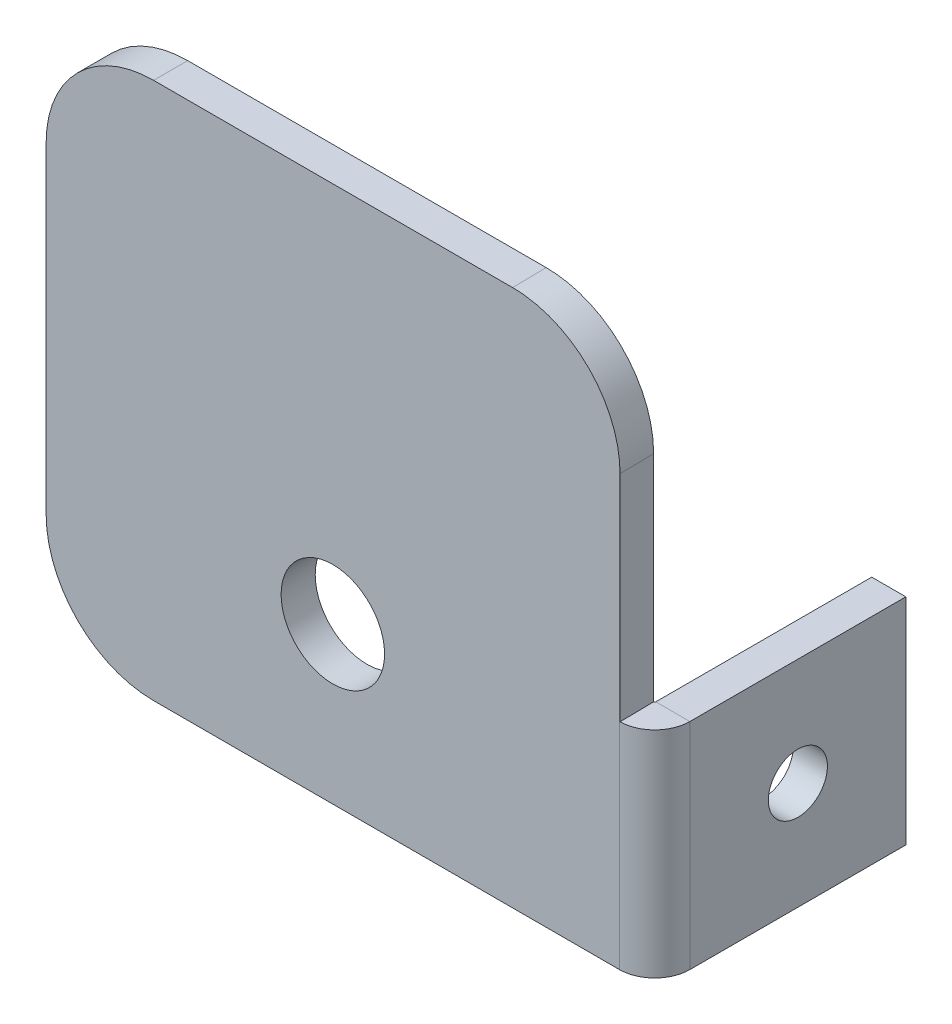
ISO-10303-21;
HEADER;
FILE_DESCRIPTION(('STEP AP214'),'2;1');
FILE_NAME('part.step','',(''),(''),'','','');
FILE_SCHEMA(('AUTOMOTIVE_DESIGN { 1 0 10303 214 1 1 1 1 }'));
ENDSEC;
DATA;
#1=APPLICATION_CONTEXT('core data for automotive mechanical design processes');
#2=APPLICATION_PROTOCOL_DEFINITION('international standard','automotive_design',2000,#1);
#3=PRODUCT_CONTEXT('',#1,'mechanical');
#4=PRODUCT('Part','Part','',(#3));
#5=PRODUCT_RELATED_PRODUCT_CATEGORY('part','',(#4));
#6=PRODUCT_DEFINITION_FORMATION('','',#4);
#7=PRODUCT_DEFINITION_CONTEXT('part definition',#1,'design');
#8=PRODUCT_DEFINITION('design','',#6,#7);
#9=PRODUCT_DEFINITION_SHAPE('','',#8);
#10=(LENGTH_UNIT() NAMED_UNIT(*) SI_UNIT(.MILLI.,.METRE.));
#11=(NAMED_UNIT(*) PLANE_ANGLE_UNIT() SI_UNIT($,.RADIAN.));
#12=(NAMED_UNIT(*) SI_UNIT($,.STERADIAN.) SOLID_ANGLE_UNIT());
#13=UNCERTAINTY_MEASURE_WITH_UNIT(LENGTH_MEASURE(1.E-05),#10,'distance_accuracy_value','');
#14=(GEOMETRIC_REPRESENTATION_CONTEXT(3) GLOBAL_UNCERTAINTY_ASSIGNED_CONTEXT((#13)) GLOBAL_UNIT_ASSIGNED_CONTEXT((#10,
#11,#12)) REPRESENTATION_CONTEXT('',''));
#15=CARTESIAN_POINT('',(0.,0.,0.));
#16=DIRECTION('',(0.,0.,1.));
#17=DIRECTION('',(1.,0.,0.));
#18=AXIS2_PLACEMENT_3D('',#15,#16,#17);
#19=CARTESIAN_POINT('',(26.7316212801133,-30.,6.625));
#20=DIRECTION('',(0.,1.,0.));
#21=DIRECTION('',(1.,0.,0.));
#22=AXIS2_PLACEMENT_3D('',#19,#20,#21);
#23=PLANE('',#22);
#24=DIRECTION('',(0.,0.,1.));
#25=VECTOR('',#24,1.);
#26=CARTESIAN_POINT('',(26.7316212801133,-30.,6.625));
#27=LINE('',#26,#25);
#28=CARTESIAN_POINT('',(26.7316212801132,-30.,-23.375));
#29=VERTEX_POINT('',#28);
#30=CARTESIAN_POINT('',(26.7316212801132,-30.,-3.27499999999999));
#31=VERTEX_POINT('',#30);
#32=EDGE_CURVE('E203',#29,#31,#27,.T.);
#33=ORIENTED_EDGE('',*,*,#32,.T.);
#34=DIRECTION('',(1.,0.,0.));
#35=VECTOR('',#34,1.);
#36=CARTESIAN_POINT('',(26.7316212801132,-30.,-3.27499999999999));
#37=LINE('',#36,#35);
#38=CARTESIAN_POINT('',(29.9066212801132,-30.,-3.27500000000001));
#39=VERTEX_POINT('',#38);
#40=EDGE_CURVE('E160',#31,#39,#37,.T.);
#41=ORIENTED_EDGE('',*,*,#40,.T.);
#42=DIRECTION('',(0.,0.,1.));
#43=VECTOR('',#42,1.);
#44=CARTESIAN_POINT('',(29.9066212801133,-30.,6.62499999999999));
#45=LINE('',#44,#43);
#46=CARTESIAN_POINT('',(29.9066212801132,-30.,-23.375));
#47=VERTEX_POINT('',#46);
#48=EDGE_CURVE('E208',#47,#39,#45,.T.);
#49=ORIENTED_EDGE('',*,*,#48,.F.);
#50=DIRECTION('',(1.,0.,0.));
#51=VECTOR('',#50,1.);
#52=CARTESIAN_POINT('',(26.7316212801132,-30.,-23.375));
#53=LINE('',#52,#51);
#54=EDGE_CURVE('E209',#29,#47,#53,.T.);
#55=ORIENTED_EDGE('',*,*,#54,.F.);
#56=EDGE_LOOP('',(#33,#41,#49,#55));
#57=FACE_BOUND('',#56,.T.);
#58=ADVANCED_FACE('F43',(#57),#23,.T.);
#59=CARTESIAN_POINT('',(26.7316212801135,-50.,60.0882425602265));
#60=DIRECTION('',(0.,-1.,0.));
#61=DIRECTION('',(0.,0.,-1.));
#62=AXIS2_PLACEMENT_3D('',#59,#60,#61);
#63=PLANE('',#62);
#64=DIRECTION('',(0.,0.,-1.));
#65=VECTOR('',#64,1.);
#66=CARTESIAN_POINT('',(29.9066212801135,-50.,60.0882425602265));
#67=LINE('',#66,#65);
#68=CARTESIAN_POINT('',(29.9066212801132,-50.,-3.27500000000001));
#69=VERTEX_POINT('',#68);
#70=CARTESIAN_POINT('',(29.9066212801132,-50.,-23.375));
#71=VERTEX_POINT('',#70);
#72=EDGE_CURVE('E178',#69,#71,#67,.T.);
#73=ORIENTED_EDGE('',*,*,#72,.F.);
#74=DIRECTION('',(-1.,0.,0.));
#75=VECTOR('',#74,1.);
#76=CARTESIAN_POINT('',(26.7316212801132,-50.,-3.275));
#77=LINE('',#76,#75);
#78=CARTESIAN_POINT('',(26.7316212801132,-50.,-3.275));
#79=VERTEX_POINT('',#78);
#80=EDGE_CURVE('E216',#69,#79,#77,.T.);
#81=ORIENTED_EDGE('',*,*,#80,.T.);
#82=DIRECTION('',(0.,0.,-1.));
#83=VECTOR('',#82,1.);
#84=CARTESIAN_POINT('',(26.7316212801135,-50.,60.0882425602265));
#85=LINE('',#84,#83);
#86=CARTESIAN_POINT('',(26.7316212801132,-50.,-23.375));
#87=VERTEX_POINT('',#86);
#88=EDGE_CURVE('E204',#79,#87,#85,.T.);
#89=ORIENTED_EDGE('',*,*,#88,.T.);
#90=DIRECTION('',(1.,0.,0.));
#91=VECTOR('',#90,1.);
#92=CARTESIAN_POINT('',(26.7316212801132,-50.,-23.375));
#93=LINE('',#92,#91);
#94=EDGE_CURVE('E212',#87,#71,#93,.T.);
#95=ORIENTED_EDGE('',*,*,#94,.T.);
#96=EDGE_LOOP('',(#73,#81,#89,#95));
#97=FACE_BOUND('',#96,.T.);
#98=ADVANCED_FACE('F305',(#97),#63,.T.);
#99=CARTESIAN_POINT('',(29.9066212801134,0.,33.3566212801132));
#100=DIRECTION('',(1.,0.,0.));
#101=DIRECTION('',(0.,0.,-1.));
#102=AXIS2_PLACEMENT_3D('',#99,#100,#101);
#103=PLANE('',#102);
#104=CARTESIAN_POINT('',(29.9066212801133,-40.,-13.325));
#105=DIRECTION('',(-1.,0.,0.));
#106=DIRECTION('',(0.,0.,1.));
#107=AXIS2_PLACEMENT_3D('',#104,#105,#106);
#108=CIRCLE('',#107,2.75);
#109=CARTESIAN_POINT('',(29.9066212801133,-40.,-10.575));
#110=VERTEX_POINT('',#109);
#111=EDGE_CURVE('E366',#110,#110,#108,.T.);
#112=ORIENTED_EDGE('',*,*,#111,.T.);
#113=EDGE_LOOP('',(#112));
#114=FACE_BOUND('',#113,.T.);
#115=ORIENTED_EDGE('',*,*,#48,.T.);
#116=DIRECTION('',(0.,-1.,0.));
#117=VECTOR('',#116,1.);
#118=CARTESIAN_POINT('',(29.9066212801132,0.,-3.275));
#119=LINE('',#118,#117);
#120=EDGE_CURVE('E218',#39,#69,#119,.T.);
#121=ORIENTED_EDGE('',*,*,#120,.T.);
#122=ORIENTED_EDGE('',*,*,#72,.T.);
#123=DIRECTION('',(0.,1.,0.));
#124=VECTOR('',#123,1.);
#125=CARTESIAN_POINT('',(29.9066212801132,-30.,-23.375));
#126=LINE('',#125,#124);
#127=EDGE_CURVE('E205',#71,#47,#126,.T.);
#128=ORIENTED_EDGE('',*,*,#127,.T.);
#129=EDGE_LOOP('',(#115,#121,#122,#128));
#130=FACE_BOUND('',#129,.T.);
#131=ADVANCED_FACE('F300',(#114,#130),#103,.T.);
#132=CARTESIAN_POINT('',(26.7316212801132,-30.,-23.375));
#133=DIRECTION('',(0.,0.,-1.));
#134=DIRECTION('',(-1.,0.,0.));
#135=AXIS2_PLACEMENT_3D('',#132,#133,#134);
#136=PLANE('',#135);
#137=ORIENTED_EDGE('',*,*,#127,.F.);
#138=ORIENTED_EDGE('',*,*,#94,.F.);
#139=DIRECTION('',(0.,1.,0.));
#140=VECTOR('',#139,1.);
#141=CARTESIAN_POINT('',(26.7316212801132,-30.,-23.375));
#142=LINE('',#141,#140);
#143=EDGE_CURVE('E200',#87,#29,#142,.T.);
#144=ORIENTED_EDGE('',*,*,#143,.T.);
#145=ORIENTED_EDGE('',*,*,#54,.T.);
#146=EDGE_LOOP('',(#137,#138,#144,#145));
#147=FACE_BOUND('',#146,.T.);
#148=ADVANCED_FACE('F297',(#147),#136,.T.);
#149=CARTESIAN_POINT('',(26.7316212801134,0.,33.3566212801133));
#150=DIRECTION('',(1.,0.,0.));
#151=DIRECTION('',(0.,0.,-1.));
#152=AXIS2_PLACEMENT_3D('',#149,#150,#151);
#153=PLANE('',#152);
#154=CARTESIAN_POINT('',(26.7316212801132,-40.,-13.325));
#155=DIRECTION('',(-1.,0.,0.));
#156=DIRECTION('',(0.,0.,1.));
#157=AXIS2_PLACEMENT_3D('',#154,#155,#156);
#158=CIRCLE('',#157,2.75);
#159=CARTESIAN_POINT('',(26.7316212801132,-40.,-10.575));
#160=VERTEX_POINT('',#159);
#161=EDGE_CURVE('E369',#160,#160,#158,.T.);
#162=ORIENTED_EDGE('',*,*,#161,.F.);
#163=EDGE_LOOP('',(#162));
#164=FACE_BOUND('',#163,.T.);
#165=DIRECTION('',(0.,-1.,0.));
#166=VECTOR('',#165,1.);
#167=CARTESIAN_POINT('',(26.7316212801132,0.,-3.27499999999999));
#168=LINE('',#167,#166);
#169=EDGE_CURVE('E211',#31,#79,#168,.T.);
#170=ORIENTED_EDGE('',*,*,#169,.F.);
#171=ORIENTED_EDGE('',*,*,#32,.F.);
#172=ORIENTED_EDGE('',*,*,#143,.F.);
#173=ORIENTED_EDGE('',*,*,#88,.F.);
#174=EDGE_LOOP('',(#170,#171,#172,#173));
#175=FACE_BOUND('',#174,.T.);
#176=ADVANCED_FACE('F281',(#164,#175),#153,.F.);
#177=CARTESIAN_POINT('',(-26.7316212801132,0.,-3.175));
#178=DIRECTION('',(-1.,0.,0.));
#179=DIRECTION('',(0.,-1.,0.));
#180=AXIS2_PLACEMENT_3D('',#177,#178,#179);
#181=PLANE('',#180);
#182=DIRECTION('',(0.,-1.,0.));
#183=VECTOR('',#182,1.);
#184=CARTESIAN_POINT('',(-26.7316212801132,0.,-3.175));
#185=LINE('',#184,#183);
#186=CARTESIAN_POINT('',(-26.7316212801132,-10.,-3.175));
#187=VERTEX_POINT('',#186);
#188=CARTESIAN_POINT('',(-26.7316212801132,-40.,-3.175));
#189=VERTEX_POINT('',#188);
#190=EDGE_CURVE('E192',#187,#189,#185,.T.);
#191=ORIENTED_EDGE('',*,*,#190,.T.);
#192=DIRECTION('',(0.,0.,1.));
#193=VECTOR('',#192,1.);
#194=CARTESIAN_POINT('',(-26.7316212801132,-40.,-3.175));
#195=LINE('',#194,#193);
#196=CARTESIAN_POINT('',(-26.7316212801132,-40.,0.));
#197=VERTEX_POINT('',#196);
#198=EDGE_CURVE('E231',#189,#197,#195,.T.);
#199=ORIENTED_EDGE('',*,*,#198,.T.);
#200=DIRECTION('',(0.,-1.,0.));
#201=VECTOR('',#200,1.);
#202=CARTESIAN_POINT('',(-26.7316212801132,0.,0.));
#203=LINE('',#202,#201);
#204=CARTESIAN_POINT('',(-26.7316212801132,-10.,0.));
#205=VERTEX_POINT('',#204);
#206=EDGE_CURVE('E181',#205,#197,#203,.T.);
#207=ORIENTED_EDGE('',*,*,#206,.F.);
#208=DIRECTION('',(0.,0.,1.));
#209=VECTOR('',#208,1.);
#210=CARTESIAN_POINT('',(-26.7316212801132,-10.,-3.175));
#211=LINE('',#210,#209);
#212=EDGE_CURVE('E222',#205,#187,#211,.F.);
#213=ORIENTED_EDGE('',*,*,#212,.T.);
#214=EDGE_LOOP('',(#191,#199,#207,#213));
#215=FACE_BOUND('',#214,.T.);
#216=ADVANCED_FACE('F277',(#215),#181,.T.);
#217=CARTESIAN_POINT('',(0.,0.,-3.175));
#218=DIRECTION('',(0.,0.,1.));
#219=DIRECTION('',(1.,0.,0.));
#220=AXIS2_PLACEMENT_3D('',#217,#218,#219);
#221=PLANE('',#220);
#222=CARTESIAN_POINT('',(-0.0499999999999892,-35.5,-3.175));
#223=DIRECTION('',(0.,0.,-1.));
#224=DIRECTION('',(-1.,0.,0.));
#225=AXIS2_PLACEMENT_3D('',#222,#223,#224);
#226=CIRCLE('',#225,4.815);
#227=CARTESIAN_POINT('',(-4.86499999999999,-35.5,-3.175));
#228=VERTEX_POINT('',#227);
#229=EDGE_CURVE('E167',#228,#228,#226,.T.);
#230=ORIENTED_EDGE('',*,*,#229,.F.);
#231=EDGE_LOOP('',(#230));
#232=FACE_BOUND('',#231,.T.);
#233=DIRECTION('',(1.,0.,0.));
#234=VECTOR('',#233,1.);
#235=CARTESIAN_POINT('',(-26.7316212801132,-50.,-3.175));
#236=LINE('',#235,#234);
#237=CARTESIAN_POINT('',(-16.7316212801132,-50.,-3.175));
#238=VERTEX_POINT('',#237);
#239=CARTESIAN_POINT('',(26.6316212801133,-50.,-3.175));
#240=VERTEX_POINT('',#239);
#241=EDGE_CURVE('E187',#238,#240,#236,.T.);
#242=ORIENTED_EDGE('',*,*,#241,.F.);
#243=CARTESIAN_POINT('',(-16.7316212801132,-40.,-3.175));
#244=DIRECTION('',(0.,0.,1.));
#245=DIRECTION('',(1.,0.,0.));
#246=AXIS2_PLACEMENT_3D('',#243,#244,#245);
#247=CIRCLE('',#246,10.);
#248=EDGE_CURVE('E246',#238,#189,#247,.F.);
#249=ORIENTED_EDGE('',*,*,#248,.T.);
#250=ORIENTED_EDGE('',*,*,#190,.F.);
#251=CARTESIAN_POINT('',(-16.7316212801132,-10.,-3.175));
#252=DIRECTION('',(0.,0.,1.));
#253=DIRECTION('',(1.,0.,0.));
#254=AXIS2_PLACEMENT_3D('',#251,#252,#253);
#255=CIRCLE('',#254,10.);
#256=CARTESIAN_POINT('',(-16.7316212801132,0.,-3.175));
#257=VERTEX_POINT('',#256);
#258=EDGE_CURVE('E244',#187,#257,#255,.F.);
#259=ORIENTED_EDGE('',*,*,#258,.T.);
#260=DIRECTION('',(-1.,0.,0.));
#261=VECTOR('',#260,1.);
#262=CARTESIAN_POINT('',(26.7316212801132,0.,-3.175));
#263=LINE('',#262,#261);
#264=CARTESIAN_POINT('',(16.631958378248,0.,-3.175));
#265=VERTEX_POINT('',#264);
#266=EDGE_CURVE('E175',#265,#257,#263,.T.);
#267=ORIENTED_EDGE('',*,*,#266,.F.);
#268=CARTESIAN_POINT('',(16.631958378248,-10.,-3.175));
#269=DIRECTION('',(0.,0.,1.));
#270=DIRECTION('',(1.,0.,0.));
#271=AXIS2_PLACEMENT_3D('',#268,#269,#270);
#272=ELLIPSE('',#271,10.0012338273976,10.);
#273=CARTESIAN_POINT('',(26.6316212801132,-9.82276521948083,-3.175));
#274=VERTEX_POINT('',#273);
#275=EDGE_CURVE('E242',#265,#274,#272,.F.);
#276=ORIENTED_EDGE('',*,*,#275,.T.);
#277=DIRECTION('',(0.,-1.,0.));
#278=VECTOR('',#277,1.);
#279=CARTESIAN_POINT('',(26.6316212801133,0.,-3.175));
#280=LINE('',#279,#278);
#281=EDGE_CURVE('E190',#274,#240,#280,.T.);
#282=ORIENTED_EDGE('',*,*,#281,.T.);
#283=EDGE_LOOP('',(#242,#249,#250,#259,#267,#276,#282));
#284=FACE_BOUND('',#283,.T.);
#285=ADVANCED_FACE('F280',(#232,#284),#221,.F.);
#286=CARTESIAN_POINT('',(-26.7316212801132,-50.,-3.175));
#287=DIRECTION('',(0.,-1.,0.));
#288=DIRECTION('',(1.,0.,0.));
#289=AXIS2_PLACEMENT_3D('',#286,#287,#288);
#290=PLANE('',#289);
#291=DIRECTION('',(1.,0.,0.));
#292=VECTOR('',#291,1.);
#293=CARTESIAN_POINT('',(-26.7316212801132,-50.,0.));
#294=LINE('',#293,#292);
#295=CARTESIAN_POINT('',(-16.7316212801132,-50.,0.));
#296=VERTEX_POINT('',#295);
#297=CARTESIAN_POINT('',(26.6316212801133,-50.,0.));
#298=VERTEX_POINT('',#297);
#299=EDGE_CURVE('E179',#296,#298,#294,.T.);
#300=ORIENTED_EDGE('',*,*,#299,.F.);
#301=DIRECTION('',(0.,0.,1.));
#302=VECTOR('',#301,1.);
#303=CARTESIAN_POINT('',(-16.7316212801132,-50.,-3.175));
#304=LINE('',#303,#302);
#305=EDGE_CURVE('E240',#296,#238,#304,.F.);
#306=ORIENTED_EDGE('',*,*,#305,.T.);
#307=ORIENTED_EDGE('',*,*,#241,.T.);
#308=DIRECTION('',(0.,0.,-1.));
#309=VECTOR('',#308,1.);
#310=CARTESIAN_POINT('',(26.6316212801132,-50.,-3.175));
#311=LINE('',#310,#309);
#312=EDGE_CURVE('E195',#298,#240,#311,.T.);
#313=ORIENTED_EDGE('',*,*,#312,.F.);
#314=EDGE_LOOP('',(#300,#306,#307,#313));
#315=FACE_BOUND('',#314,.T.);
#316=ADVANCED_FACE('F285',(#315),#290,.T.);
#317=CARTESIAN_POINT('',(0.,0.,0.));
#318=DIRECTION('',(0.,0.,1.));
#319=DIRECTION('',(1.,0.,0.));
#320=AXIS2_PLACEMENT_3D('',#317,#318,#319);
#321=PLANE('',#320);
#322=CARTESIAN_POINT('',(-0.0499999999999892,-35.5,0.));
#323=DIRECTION('',(0.,0.,1.));
#324=DIRECTION('',(1.,0.,0.));
#325=AXIS2_PLACEMENT_3D('',#322,#323,#324);
#326=CIRCLE('',#325,4.815);
#327=CARTESIAN_POINT('',(4.76500000000001,-35.5,0.));
#328=VERTEX_POINT('',#327);
#329=EDGE_CURVE('E173',#328,#328,#326,.T.);
#330=ORIENTED_EDGE('',*,*,#329,.F.);
#331=EDGE_LOOP('',(#330));
#332=FACE_BOUND('',#331,.T.);
#333=ORIENTED_EDGE('',*,*,#206,.T.);
#334=CARTESIAN_POINT('',(-16.7316212801132,-40.,0.));
#335=DIRECTION('',(0.,0.,1.));
#336=DIRECTION('',(1.,0.,0.));
#337=AXIS2_PLACEMENT_3D('',#334,#335,#336);
#338=CIRCLE('',#337,10.);
#339=EDGE_CURVE('E238',#197,#296,#338,.T.);
#340=ORIENTED_EDGE('',*,*,#339,.T.);
#341=ORIENTED_EDGE('',*,*,#299,.T.);
#342=DIRECTION('',(0.,-1.,0.));
#343=VECTOR('',#342,1.);
#344=CARTESIAN_POINT('',(26.6316212801133,0.,0.));
#345=LINE('',#344,#343);
#346=CARTESIAN_POINT('',(26.6316212801132,-8.9869930603928,0.));
#347=VERTEX_POINT('',#346);
#348=EDGE_CURVE('E155',#347,#298,#345,.T.);
#349=ORIENTED_EDGE('',*,*,#348,.F.);
#350=CARTESIAN_POINT('',(16.681835263901,-10.,0.));
#351=DIRECTION('',(0.,0.,1.));
#352=DIRECTION('',(1.,0.,0.));
#353=AXIS2_PLACEMENT_3D('',#350,#351,#352);
#354=ELLIPSE('',#353,10.0012338273976,10.);
#355=CARTESIAN_POINT('',(16.681835263901,0.,0.));
#356=VERTEX_POINT('',#355);
#357=EDGE_CURVE('E234',#347,#356,#354,.T.);
#358=ORIENTED_EDGE('',*,*,#357,.T.);
#359=DIRECTION('',(-1.,0.,0.));
#360=VECTOR('',#359,1.);
#361=CARTESIAN_POINT('',(26.7316212801132,0.,0.));
#362=LINE('',#361,#360);
#363=CARTESIAN_POINT('',(-16.7316212801132,0.,0.));
#364=VERTEX_POINT('',#363);
#365=EDGE_CURVE('E184',#356,#364,#362,.T.);
#366=ORIENTED_EDGE('',*,*,#365,.T.);
#367=CARTESIAN_POINT('',(-16.7316212801132,-10.,0.));
#368=DIRECTION('',(0.,0.,1.));
#369=DIRECTION('',(1.,0.,0.));
#370=AXIS2_PLACEMENT_3D('',#367,#368,#369);
#371=CIRCLE('',#370,10.);
#372=EDGE_CURVE('E236',#364,#205,#371,.T.);
#373=ORIENTED_EDGE('',*,*,#372,.T.);
#374=EDGE_LOOP('',(#333,#340,#341,#349,#358,#366,#373));
#375=FACE_BOUND('',#374,.T.);
#376=ADVANCED_FACE('F289',(#332,#375),#321,.T.);
#377=CARTESIAN_POINT('',(26.7316212801132,0.,-3.175));
#378=DIRECTION('',(0.,1.,0.));
#379=DIRECTION('',(-1.,0.,0.));
#380=AXIS2_PLACEMENT_3D('',#377,#378,#379);
#381=PLANE('',#380);
#382=ORIENTED_EDGE('',*,*,#266,.T.);
#383=DIRECTION('',(0.,0.,1.));
#384=VECTOR('',#383,1.);
#385=CARTESIAN_POINT('',(-16.7316212801132,0.,-3.175));
#386=LINE('',#385,#384);
#387=EDGE_CURVE('E251',#257,#364,#386,.T.);
#388=ORIENTED_EDGE('',*,*,#387,.T.);
#389=ORIENTED_EDGE('',*,*,#365,.F.);
#390=DIRECTION('',(0.0157073173119235,0.,0.999876632481659));
#391=VECTOR('',#390,1.);
#392=CARTESIAN_POINT('',(16.6344501652323,0.,-3.01638096090856));
#393=LINE('',#392,#391);
#394=EDGE_CURVE('E248',#356,#265,#393,.F.);
#395=ORIENTED_EDGE('',*,*,#394,.T.);
#396=EDGE_LOOP('',(#382,#388,#389,#395));
#397=FACE_BOUND('',#396,.T.);
#398=ADVANCED_FACE('F274',(#397),#381,.T.);
#399=CARTESIAN_POINT('',(26.6316212801132,-30.,-3.275));
#400=DIRECTION('',(0.,-1.,0.));
#401=DIRECTION('',(0.,0.,-1.));
#402=AXIS2_PLACEMENT_3D('',#399,#400,#401);
#403=PLANE('',#402);
#404=DIRECTION('',(-0.0157073173119362,0.,-0.999876632481659));
#405=VECTOR('',#404,1.);
#406=CARTESIAN_POINT('',(26.6331920118444,-30.,-3.17501233675183));
#407=LINE('',#406,#405);
#408=CARTESIAN_POINT('',(26.6830627443098,-30.,-0.00040402862256728));
#409=VERTEX_POINT('',#408);
#410=CARTESIAN_POINT('',(26.6331920118444,-30.,-3.17501233675183));
#411=VERTEX_POINT('',#410);
#412=EDGE_CURVE('E146',#409,#411,#407,.T.);
#413=ORIENTED_EDGE('',*,*,#412,.F.);
#414=CARTESIAN_POINT('',(26.6316212801132,-30.,-3.275));
#415=DIRECTION('',(0.,-1.,0.));
#416=DIRECTION('',(1.,0.,0.));
#417=AXIS2_PLACEMENT_3D('',#414,#415,#416);
#418=CIRCLE('',#417,3.275);
#419=EDGE_CURVE('E172',#409,#39,#418,.F.);
#420=ORIENTED_EDGE('',*,*,#419,.T.);
#421=ORIENTED_EDGE('',*,*,#40,.F.);
#422=CARTESIAN_POINT('',(26.6316212801132,-30.,-3.275));
#423=DIRECTION('',(0.,1.,0.));
#424=DIRECTION('',(0.,0.,-1.));
#425=AXIS2_PLACEMENT_3D('',#422,#423,#424);
#426=CIRCLE('',#425,0.0999999999999996);
#427=EDGE_CURVE('E145',#411,#31,#426,.T.);
#428=ORIENTED_EDGE('',*,*,#427,.F.);
#429=EDGE_LOOP('',(#413,#420,#421,#428));
#430=FACE_BOUND('',#429,.T.);
#431=ADVANCED_FACE('F158',(#430),#403,.F.);
#432=CARTESIAN_POINT('',(26.6316212801132,-50.,-3.275));
#433=DIRECTION('',(0.,1.,0.));
#434=DIRECTION('',(0.,0.,1.));
#435=AXIS2_PLACEMENT_3D('',#432,#433,#434);
#436=PLANE('',#435);
#437=ORIENTED_EDGE('',*,*,#80,.F.);
#438=CARTESIAN_POINT('',(26.6316212801132,-50.,-3.275));
#439=DIRECTION('',(0.,-1.,0.));
#440=DIRECTION('',(1.,0.,0.));
#441=AXIS2_PLACEMENT_3D('',#438,#439,#440);
#442=CIRCLE('',#441,3.275);
#443=EDGE_CURVE('E164',#69,#298,#442,.T.);
#444=ORIENTED_EDGE('',*,*,#443,.T.);
#445=ORIENTED_EDGE('',*,*,#312,.T.);
#446=CARTESIAN_POINT('',(26.6316212801132,-50.,-3.275));
#447=DIRECTION('',(0.,-1.,0.));
#448=DIRECTION('',(0.,0.,1.));
#449=AXIS2_PLACEMENT_3D('',#446,#447,#448);
#450=CIRCLE('',#449,0.0999999999999996);
#451=EDGE_CURVE('E147',#79,#240,#450,.T.);
#452=ORIENTED_EDGE('',*,*,#451,.F.);
#453=EDGE_LOOP('',(#437,#444,#445,#452));
#454=FACE_BOUND('',#453,.T.);
#455=ADVANCED_FACE('F268',(#454),#436,.F.);
#456=CARTESIAN_POINT('',(26.6331920118444,-15.,-3.17501233675183));
#457=DIRECTION('',(-0.999876632481659,0.,0.0157073173119235));
#458=DIRECTION('',(0.,-1.,0.));
#459=AXIS2_PLACEMENT_3D('',#456,#457,#458);
#460=PLANE('',#459);
#461=DIRECTION('',(0.,-1.,0.));
#462=VECTOR('',#461,1.);
#463=CARTESIAN_POINT('',(26.6331920118444,-30.,-3.17501233675183));
#464=LINE('',#463,#462);
#465=CARTESIAN_POINT('',(26.6331920118444,-10.,-3.17501233675183));
#466=VERTEX_POINT('',#465);
#467=EDGE_CURVE('E140',#466,#411,#464,.T.);
#468=ORIENTED_EDGE('',*,*,#467,.F.);
#469=DIRECTION('',(-0.0157073173119235,0.,-0.999876632481659));
#470=VECTOR('',#469,1.);
#471=CARTESIAN_POINT('',(26.6331920118444,-10.,-3.17501233675183));
#472=LINE('',#471,#470);
#473=CARTESIAN_POINT('',(26.6830627443099,-10.,-0.000404028622567713));
#474=VERTEX_POINT('',#473);
#475=EDGE_CURVE('E56',#466,#474,#472,.F.);
#476=ORIENTED_EDGE('',*,*,#475,.T.);
#477=DIRECTION('',(0.,-1.,0.));
#478=VECTOR('',#477,1.);
#479=CARTESIAN_POINT('',(26.6830627443099,26.0889481688555,-0.000404028622567713));
#480=LINE('',#479,#478);
#481=EDGE_CURVE('E151',#474,#409,#480,.T.);
#482=ORIENTED_EDGE('',*,*,#481,.T.);
#483=ORIENTED_EDGE('',*,*,#412,.T.);
#484=EDGE_LOOP('',(#468,#476,#482,#483));
#485=FACE_BOUND('',#484,.T.);
#486=ADVANCED_FACE('F150',(#485),#460,.F.);
#487=CARTESIAN_POINT('',(26.6316212801133,26.0889481688555,-3.275));
#488=DIRECTION('',(0.,-1.,0.));
#489=DIRECTION('',(1.,0.,0.));
#490=AXIS2_PLACEMENT_3D('',#487,#488,#489);
#491=CYLINDRICAL_SURFACE('',#490,0.1);
#492=ORIENTED_EDGE('',*,*,#281,.F.);
#493=CARTESIAN_POINT('',(26.6316212801132,-9.82276521948083,-3.175));
#494=CARTESIAN_POINT('',(26.6321448764373,-9.85230202926887,-3.17500257025657));
#495=CARTESIAN_POINT('',(26.6325375689103,-9.88183999920168,-3.17500488344751));
#496=CARTESIAN_POINT('',(26.6330611461542,-9.94091825937473,-3.17500899569812));
#497=CARTESIAN_POINT('',(26.633192030925,-9.97045854961498,-3.17501079475779));
#498=CARTESIAN_POINT('',(26.6331920118444,-10.,-3.17501233675183));
#499=B_SPLINE_CURVE_WITH_KNOTS('',3,(#493,#494,#495,#496,#497,#498),.UNSPECIFIED.,.F.,.F.,(4,2,
4),(0.,0.0886217406979072,0.177243481449489),.UNSPECIFIED.);
#500=EDGE_CURVE('E70',#274,#466,#499,.T.);
#501=ORIENTED_EDGE('',*,*,#500,.T.);
#502=ORIENTED_EDGE('',*,*,#467,.T.);
#503=ORIENTED_EDGE('',*,*,#427,.T.);
#504=ORIENTED_EDGE('',*,*,#169,.T.);
#505=ORIENTED_EDGE('',*,*,#451,.T.);
#506=EDGE_LOOP('',(#492,#501,#502,#503,#504,#505));
#507=FACE_BOUND('',#506,.T.);
#508=ADVANCED_FACE('F142',(#507),#491,.F.);
#509=CARTESIAN_POINT('',(26.6316212801133,26.0889481688555,-3.275));
#510=DIRECTION('',(0.,-1.,0.));
#511=DIRECTION('',(1.,0.,0.));
#512=AXIS2_PLACEMENT_3D('',#509,#510,#511);
#513=CYLINDRICAL_SURFACE('',#512,3.275);
#514=ORIENTED_EDGE('',*,*,#481,.F.);
#515=CARTESIAN_POINT('',(26.6830627443098,-10.,-0.000404028622566874));
#516=CARTESIAN_POINT('',(26.6830629411966,-9.91541047691669,-0.00040613979876763));
#517=CARTESIAN_POINT('',(26.6819895686028,-9.83082096639821,-0.0003871692694037));
#518=CARTESIAN_POINT('',(26.6776985433622,-9.6617508088832,-0.000322926388248978));
#519=CARTESIAN_POINT('',(26.6744822704667,-9.57727012686087,-0.000277670962944299));
#520=CARTESIAN_POINT('',(26.6659082989727,-9.40841749798998,-0.000176681843311756));
#521=CARTESIAN_POINT('',(26.6605506003134,-9.32404555114451,-0.000120948148686811));
#522=CARTESIAN_POINT('',(26.6476928909654,-9.15541041791141,-3.36405569614022E-05));
#523=CARTESIAN_POINT('',(26.6401915035284,-9.0711473364885,-2.08223418310497E-06));
#524=CARTESIAN_POINT('',(26.6316212801132,-8.98699306039281,0.));
#525=B_SPLINE_CURVE_WITH_KNOTS('',3,(#515,#516,#517,#518,#519,#520,#521,#522,#523,#524),
.UNSPECIFIED.,.F.,.F.,(4,2,2,2,4),(0.,0.253761736751229,0.507360241367563,0.760958753173962,
1.01472050181352),.UNSPECIFIED.);
#526=EDGE_CURVE('E12',#474,#347,#525,.T.);
#527=ORIENTED_EDGE('',*,*,#526,.T.);
#528=ORIENTED_EDGE('',*,*,#348,.T.);
#529=ORIENTED_EDGE('',*,*,#443,.F.);
#530=ORIENTED_EDGE('',*,*,#120,.F.);
#531=ORIENTED_EDGE('',*,*,#419,.F.);
#532=EDGE_LOOP('',(#514,#527,#528,#529,#530,#531));
#533=FACE_BOUND('',#532,.T.);
#534=ADVANCED_FACE('F261',(#533),#513,.T.);
#535=CARTESIAN_POINT('',(-0.0499999999999892,-35.5,6.825));
#536=DIRECTION('',(0.,0.,-1.));
#537=DIRECTION('',(-1.,0.,0.));
#538=AXIS2_PLACEMENT_3D('',#535,#536,#537);
#539=CYLINDRICAL_SURFACE('',#538,4.815);
#540=ORIENTED_EDGE('',*,*,#329,.T.);
#541=EDGE_LOOP('',(#540));
#542=FACE_BOUND('',#541,.T.);
#543=ORIENTED_EDGE('',*,*,#229,.T.);
#544=EDGE_LOOP('',(#543));
#545=FACE_BOUND('',#544,.T.);
#546=ADVANCED_FACE('F262',(#542,#545),#539,.F.);
#547=CARTESIAN_POINT('',(-16.7316212801132,-40.,-3.175));
#548=DIRECTION('',(0.,0.,1.));
#549=DIRECTION('',(1.,0.,0.));
#550=AXIS2_PLACEMENT_3D('',#547,#548,#549);
#551=CYLINDRICAL_SURFACE('',#550,10.);
#552=ORIENTED_EDGE('',*,*,#248,.F.);
#553=ORIENTED_EDGE('',*,*,#305,.F.);
#554=ORIENTED_EDGE('',*,*,#339,.F.);
#555=ORIENTED_EDGE('',*,*,#198,.F.);
#556=EDGE_LOOP('',(#552,#553,#554,#555));
#557=FACE_BOUND('',#556,.T.);
#558=ADVANCED_FACE('F315',(#557),#551,.T.);
#559=CARTESIAN_POINT('',(-16.7316212801132,-10.,-3.175));
#560=DIRECTION('',(0.,0.,1.));
#561=DIRECTION('',(1.,0.,0.));
#562=AXIS2_PLACEMENT_3D('',#559,#560,#561);
#563=CYLINDRICAL_SURFACE('',#562,10.);
#564=ORIENTED_EDGE('',*,*,#258,.F.);
#565=ORIENTED_EDGE('',*,*,#212,.F.);
#566=ORIENTED_EDGE('',*,*,#372,.F.);
#567=ORIENTED_EDGE('',*,*,#387,.F.);
#568=EDGE_LOOP('',(#564,#565,#566,#567));
#569=FACE_BOUND('',#568,.T.);
#570=ADVANCED_FACE('F317',(#569),#563,.T.);
#571=CARTESIAN_POINT('',(16.6344501652323,-10.,-3.01638096090856));
#572=DIRECTION('',(0.0157073173119235,0.,0.999876632481659));
#573=DIRECTION('',(0.999876632481659,0.,-0.0157073173119235));
#574=AXIS2_PLACEMENT_3D('',#571,#572,#573);
#575=CYLINDRICAL_SURFACE('',#574,10.);
#576=ORIENTED_EDGE('',*,*,#526,.F.);
#577=ORIENTED_EDGE('',*,*,#475,.F.);
#578=ORIENTED_EDGE('',*,*,#500,.F.);
#579=ORIENTED_EDGE('',*,*,#275,.F.);
#580=ORIENTED_EDGE('',*,*,#394,.F.);
#581=ORIENTED_EDGE('',*,*,#357,.F.);
#582=EDGE_LOOP('',(#576,#577,#578,#579,#580,#581));
#583=FACE_BOUND('',#582,.T.);
#584=ADVANCED_FACE('F45',(#583),#575,.T.);
#585=CARTESIAN_POINT('',(29.9066212801133,-40.,-13.325));
#586=DIRECTION('',(-1.,0.,0.));
#587=DIRECTION('',(0.,0.,1.));
#588=AXIS2_PLACEMENT_3D('',#585,#586,#587);
#589=CYLINDRICAL_SURFACE('',#588,2.75);
#590=CARTESIAN_POINT('',(29.9066212801133,-40.,-10.575));
#591=CARTESIAN_POINT('',(29.8735483634466,-40.,-10.575));
#592=CARTESIAN_POINT('',(29.84047544678,-40.,-10.575));
#593=CARTESIAN_POINT('',(29.7743296134466,-40.,-10.575));
#594=CARTESIAN_POINT('',(29.7412566967799,-40.,-10.575));
#595=CARTESIAN_POINT('',(29.6751108634466,-40.,-10.575));
#596=CARTESIAN_POINT('',(29.64203794678,-40.,-10.575));
#597=CARTESIAN_POINT('',(29.5758921134466,-40.,-10.575));
#598=CARTESIAN_POINT('',(29.5428191967799,-40.,-10.575));
#599=CARTESIAN_POINT('',(29.4766733634466,-40.,-10.575));
#600=CARTESIAN_POINT('',(29.4436004467799,-40.,-10.575));
#601=CARTESIAN_POINT('',(29.3774546134466,-40.,-10.575));
#602=CARTESIAN_POINT('',(29.3443816967799,-40.,-10.575));
#603=CARTESIAN_POINT('',(29.2782358634466,-40.,-10.575));
#604=CARTESIAN_POINT('',(29.2451629467799,-40.,-10.575));
#605=CARTESIAN_POINT('',(29.1790171134466,-40.,-10.575));
#606=CARTESIAN_POINT('',(29.1459441967799,-40.,-10.575));
#607=CARTESIAN_POINT('',(29.0797983634466,-40.,-10.575));
#608=CARTESIAN_POINT('',(29.0467254467799,-40.,-10.575));
#609=CARTESIAN_POINT('',(28.9805796134466,-40.,-10.575));
#610=CARTESIAN_POINT('',(28.9475066967799,-40.,-10.575));
#611=CARTESIAN_POINT('',(28.8813608634466,-40.,-10.575));
#612=CARTESIAN_POINT('',(28.8482879467799,-40.,-10.575));
#613=CARTESIAN_POINT('',(28.7821421134466,-40.,-10.575));
#614=CARTESIAN_POINT('',(28.7490691967799,-40.,-10.575));
#615=CARTESIAN_POINT('',(28.6829233634466,-40.,-10.575));
#616=CARTESIAN_POINT('',(28.6498504467799,-40.,-10.575));
#617=CARTESIAN_POINT('',(28.5837046134466,-40.,-10.575));
#618=CARTESIAN_POINT('',(28.5506316967799,-40.,-10.575));
#619=CARTESIAN_POINT('',(28.4844858634466,-40.,-10.575));
#620=CARTESIAN_POINT('',(28.4514129467799,-40.,-10.575));
#621=CARTESIAN_POINT('',(28.3852671134466,-40.,-10.575));
#622=CARTESIAN_POINT('',(28.3521941967799,-40.,-10.575));
#623=CARTESIAN_POINT('',(28.2860483634466,-40.,-10.575));
#624=CARTESIAN_POINT('',(28.2529754467799,-40.,-10.575));
#625=CARTESIAN_POINT('',(28.1868296134466,-40.,-10.575));
#626=CARTESIAN_POINT('',(28.1537566967799,-40.,-10.575));
#627=CARTESIAN_POINT('',(28.0876108634466,-40.,-10.575));
#628=CARTESIAN_POINT('',(28.0545379467799,-40.,-10.575));
#629=CARTESIAN_POINT('',(27.9883921134466,-40.,-10.575));
#630=CARTESIAN_POINT('',(27.9553191967799,-40.,-10.575));
#631=CARTESIAN_POINT('',(27.8891733634466,-40.,-10.575));
#632=CARTESIAN_POINT('',(27.8561004467799,-40.,-10.575));
#633=CARTESIAN_POINT('',(27.7899546134466,-40.,-10.575));
#634=CARTESIAN_POINT('',(27.7568816967799,-40.,-10.575));
#635=CARTESIAN_POINT('',(27.6907358634466,-40.,-10.575));
#636=CARTESIAN_POINT('',(27.6576629467799,-40.,-10.575));
#637=CARTESIAN_POINT('',(27.5915171134466,-40.,-10.575));
#638=CARTESIAN_POINT('',(27.5584441967799,-40.,-10.575));
#639=CARTESIAN_POINT('',(27.4922983634466,-40.,-10.575));
#640=CARTESIAN_POINT('',(27.4592254467799,-40.,-10.575));
#641=CARTESIAN_POINT('',(27.3930796134466,-40.,-10.575));
#642=CARTESIAN_POINT('',(27.3600066967799,-40.,-10.575));
#643=CARTESIAN_POINT('',(27.2938608634466,-40.,-10.575));
#644=CARTESIAN_POINT('',(27.2607879467799,-40.,-10.575));
#645=CARTESIAN_POINT('',(27.1946421134466,-40.,-10.575));
#646=CARTESIAN_POINT('',(27.1615691967799,-40.,-10.575));
#647=CARTESIAN_POINT('',(27.0954233634466,-40.,-10.575));
#648=CARTESIAN_POINT('',(27.0623504467799,-40.,-10.575));
#649=CARTESIAN_POINT('',(26.9962046134466,-40.,-10.575));
#650=CARTESIAN_POINT('',(26.9631316967799,-40.,-10.575));
#651=CARTESIAN_POINT('',(26.8969858634466,-40.,-10.575));
#652=CARTESIAN_POINT('',(26.8639129467799,-40.,-10.575));
#653=CARTESIAN_POINT('',(26.7977671134466,-40.,-10.575));
#654=CARTESIAN_POINT('',(26.7646941967799,-40.,-10.575));
#655=CARTESIAN_POINT('',(26.7316212801132,-40.,-10.575));
#656=B_SPLINE_CURVE_WITH_KNOTS('',3,(#590,#591,#592,#593,#594,#595,#596,#597,#598,#599,#600,
#601,#602,#603,#604,#605,#606,#607,#608,#609,#610,#611,#612,#613,#614,#615,#616,#617,#618,#619,
#620,#621,#622,#623,#624,#625,#626,#627,#628,#629,#630,#631,#632,#633,#634,#635,#636,#637,#638,
#639,#640,#641,#642,#643,#644,#645,#646,#647,#648,#649,#650,#651,#652,#653,#654,#655),
.UNSPECIFIED.,.F.,.F.,(4,2,2,2,2,2,2,2,2,2,2,2,2,2,2,2,2,2,2,2,2,2,2,2,2,2,2,2,2,2,2,2,4),(0.,
0.0992187500000012,0.198437500000002,0.297656250000004,0.396875000000005,0.49609375000001,
0.595312500000011,0.694531250000012,0.793750000000013,0.892968750000014,0.992187500000019,
1.09140625000002,1.19062500000002,1.28984375000002,1.38906250000003,1.48828125000003,
1.58750000000003,1.68671875000003,1.78593750000003,1.88515625000004,1.98437500000004,
2.08359375000004,2.18281250000004,2.28203125000004,2.38125000000005,2.48046875000005,
2.57968750000005,2.67890625000005,2.77812500000005,2.87734375000006,2.97656250000006,
3.07578125000006,3.17500000000006),.UNSPECIFIED.);
#657=EDGE_CURVE('BSEAM324',#110,#160,#656,.T.);
#658=ORIENTED_EDGE('',*,*,#111,.F.);
#659=ORIENTED_EDGE('',*,*,#161,.T.);
#660=ORIENTED_EDGE('',*,*,#657,.T.);
#661=ORIENTED_EDGE('',*,*,#657,.F.);
#662=EDGE_LOOP('',(#658,#660,#659,#661));
#663=FACE_BOUND('',#662,.T.);
#664=ADVANCED_FACE('F324',(#663),#589,.F.);
#665=CLOSED_SHELL('',(#58,#98,#131,#148,#176,#216,#285,#316,#376,#398,#431,#455,#486,#508,#534,
#546,#558,#570,#584,#664));
#666=MANIFOLD_SOLID_BREP('B2',#665);
#667=ADVANCED_BREP_SHAPE_REPRESENTATION('',(#18,#666),#14);
#668=SHAPE_DEFINITION_REPRESENTATION(#9,#667);
ENDSEC;
END-ISO-10303-21;
